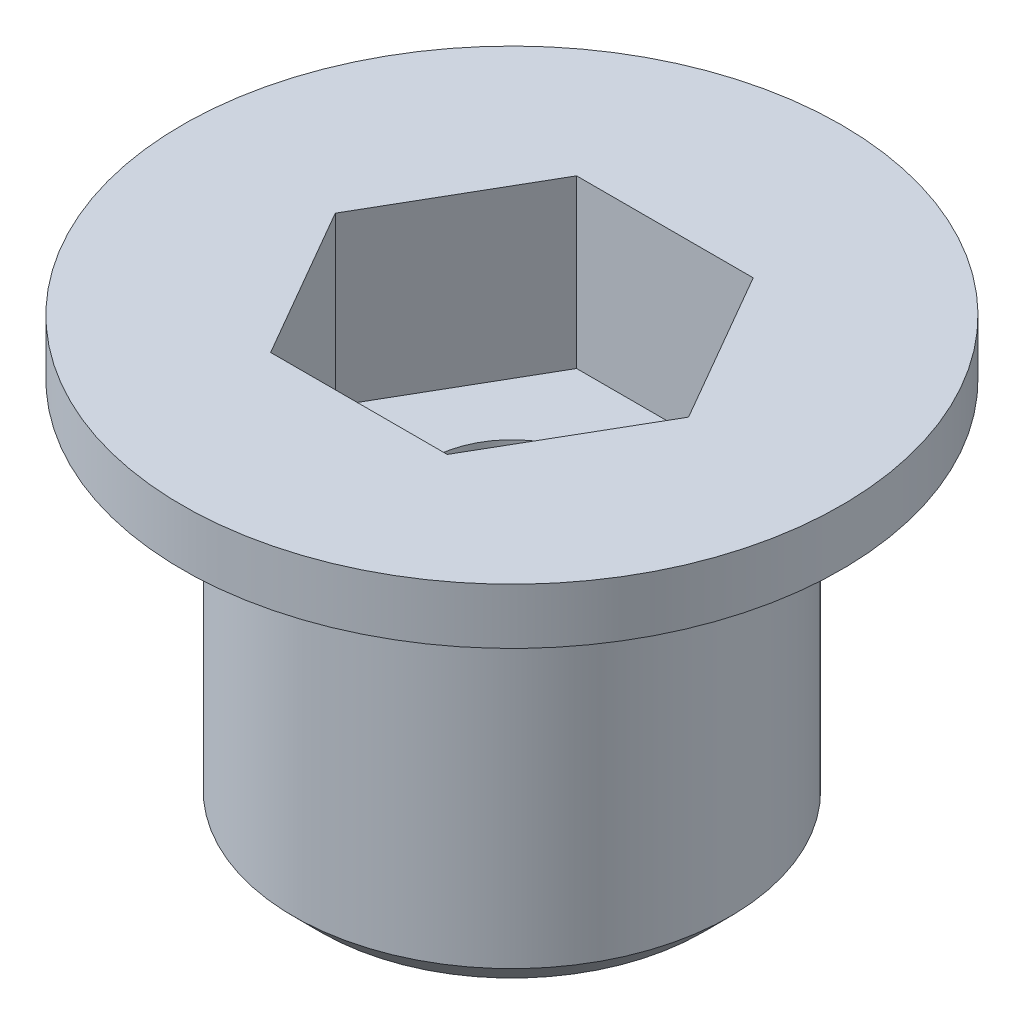
ISO-10303-21;
HEADER;
FILE_DESCRIPTION(('STEP AP214'),'2;1');
FILE_NAME('part.step','',(''),(''),'','','');
FILE_SCHEMA(('AUTOMOTIVE_DESIGN { 1 0 10303 214 1 1 1 1 }'));
ENDSEC;
DATA;
#1=APPLICATION_CONTEXT('core data for automotive mechanical design processes');
#2=APPLICATION_PROTOCOL_DEFINITION('international standard','automotive_design',2000,#1);
#3=PRODUCT_CONTEXT('',#1,'mechanical');
#4=PRODUCT('Part','Part','',(#3));
#5=PRODUCT_RELATED_PRODUCT_CATEGORY('part','',(#4));
#6=PRODUCT_DEFINITION_FORMATION('','',#4);
#7=PRODUCT_DEFINITION_CONTEXT('part definition',#1,'design');
#8=PRODUCT_DEFINITION('design','',#6,#7);
#9=PRODUCT_DEFINITION_SHAPE('','',#8);
#10=(LENGTH_UNIT() NAMED_UNIT(*) SI_UNIT(.MILLI.,.METRE.));
#11=(NAMED_UNIT(*) PLANE_ANGLE_UNIT() SI_UNIT($,.RADIAN.));
#12=(NAMED_UNIT(*) SI_UNIT($,.STERADIAN.) SOLID_ANGLE_UNIT());
#13=UNCERTAINTY_MEASURE_WITH_UNIT(LENGTH_MEASURE(1.E-05),#10,'distance_accuracy_value','');
#14=(GEOMETRIC_REPRESENTATION_CONTEXT(3) GLOBAL_UNCERTAINTY_ASSIGNED_CONTEXT((#13)) GLOBAL_UNIT_ASSIGNED_CONTEXT((#10,
#11,#12)) REPRESENTATION_CONTEXT('',''));
#15=CARTESIAN_POINT('',(0.,0.,0.));
#16=DIRECTION('',(0.,0.,1.));
#17=DIRECTION('',(1.,0.,0.));
#18=AXIS2_PLACEMENT_3D('',#15,#16,#17);
#19=CARTESIAN_POINT('',(0.,0.,0.));
#20=DIRECTION('',(0.,-1.,0.));
#21=DIRECTION('',(0.,0.,-1.));
#22=AXIS2_PLACEMENT_3D('',#19,#20,#21);
#23=CYLINDRICAL_SURFACE('',#22,1.5);
#24=CARTESIAN_POINT('',(0.,0.,0.));
#25=DIRECTION('',(0.,-1.,0.));
#26=DIRECTION('',(0.,0.,-1.));
#27=AXIS2_PLACEMENT_3D('',#24,#25,#26);
#28=CIRCLE('',#27,1.5);
#29=CARTESIAN_POINT('',(0.,0.,-1.5));
#30=VERTEX_POINT('',#29);
#31=EDGE_CURVE('E141',#30,#30,#28,.T.);
#32=ORIENTED_EDGE('',*,*,#31,.T.);
#33=EDGE_LOOP('',(#32));
#34=FACE_BOUND('',#33,.T.);
#35=CARTESIAN_POINT('',(0.,4.9,0.));
#36=DIRECTION('',(0.,1.,0.));
#37=DIRECTION('',(0.,0.,1.));
#38=AXIS2_PLACEMENT_3D('',#35,#36,#37);
#39=CIRCLE('',#38,1.5);
#40=CARTESIAN_POINT('',(0.,4.9,1.5));
#41=VERTEX_POINT('',#40);
#42=EDGE_CURVE('E37',#41,#41,#39,.T.);
#43=ORIENTED_EDGE('',*,*,#42,.T.);
#44=EDGE_LOOP('',(#43));
#45=FACE_BOUND('',#44,.T.);
#46=ADVANCED_FACE('F33',(#34,#45),#23,.F.);
#47=CARTESIAN_POINT('',(1.5,7.9,0.));
#48=DIRECTION('',(0.,1.,0.));
#49=DIRECTION('',(0.,0.,1.));
#50=AXIS2_PLACEMENT_3D('',#47,#48,#49);
#51=PLANE('',#50);
#52=DIRECTION('',(-0.5,0.,-0.866025403784438));
#53=VECTOR('',#52,1.);
#54=CARTESIAN_POINT('',(3.17542648054294,7.9,0.));
#55=LINE('',#54,#53);
#56=CARTESIAN_POINT('',(3.17542648054294,7.9,0.));
#57=VERTEX_POINT('',#56);
#58=CARTESIAN_POINT('',(1.58771324027147,7.9,-2.75));
#59=VERTEX_POINT('',#58);
#60=EDGE_CURVE('E49',#57,#59,#55,.T.);
#61=ORIENTED_EDGE('',*,*,#60,.F.);
#62=DIRECTION('',(0.5,0.,-0.866025403784439));
#63=VECTOR('',#62,1.);
#64=CARTESIAN_POINT('',(1.58771324027147,7.9,2.75));
#65=LINE('',#64,#63);
#66=CARTESIAN_POINT('',(1.58771324027147,7.9,2.75));
#67=VERTEX_POINT('',#66);
#68=EDGE_CURVE('E132',#67,#57,#65,.T.);
#69=ORIENTED_EDGE('',*,*,#68,.F.);
#70=DIRECTION('',(1.,0.,0.));
#71=VECTOR('',#70,1.);
#72=CARTESIAN_POINT('',(-1.58771324027147,7.9,2.75));
#73=LINE('',#72,#71);
#74=CARTESIAN_POINT('',(-1.58771324027147,7.9,2.75));
#75=VERTEX_POINT('',#74);
#76=EDGE_CURVE('E130',#75,#67,#73,.T.);
#77=ORIENTED_EDGE('',*,*,#76,.F.);
#78=DIRECTION('',(0.5,0.,0.866025403784438));
#79=VECTOR('',#78,1.);
#80=CARTESIAN_POINT('',(-3.17542648054294,7.9,0.));
#81=LINE('',#80,#79);
#82=CARTESIAN_POINT('',(-3.17542648054294,7.9,0.));
#83=VERTEX_POINT('',#82);
#84=EDGE_CURVE('E97',#83,#75,#81,.T.);
#85=ORIENTED_EDGE('',*,*,#84,.F.);
#86=DIRECTION('',(-0.5,0.,0.866025403784438));
#87=VECTOR('',#86,1.);
#88=CARTESIAN_POINT('',(-1.58771324027147,7.9,-2.75));
#89=LINE('',#88,#87);
#90=CARTESIAN_POINT('',(-1.58771324027147,7.9,-2.75));
#91=VERTEX_POINT('',#90);
#92=EDGE_CURVE('E126',#91,#83,#89,.T.);
#93=ORIENTED_EDGE('',*,*,#92,.F.);
#94=DIRECTION('',(-1.,0.,0.));
#95=VECTOR('',#94,1.);
#96=CARTESIAN_POINT('',(1.58771324027147,7.9,-2.75));
#97=LINE('',#96,#95);
#98=EDGE_CURVE('E123',#59,#91,#97,.T.);
#99=ORIENTED_EDGE('',*,*,#98,.F.);
#100=EDGE_LOOP('',(#61,#69,#77,#85,#93,#99));
#101=FACE_BOUND('',#100,.T.);
#102=CARTESIAN_POINT('',(0.,7.9,0.));
#103=DIRECTION('',(0.,-1.,0.));
#104=DIRECTION('',(0.,0.,-1.));
#105=AXIS2_PLACEMENT_3D('',#102,#103,#104);
#106=CIRCLE('',#105,5.925);
#107=CARTESIAN_POINT('',(0.,7.9,-5.925));
#108=VERTEX_POINT('',#107);
#109=EDGE_CURVE('E147',#108,#108,#106,.T.);
#110=ORIENTED_EDGE('',*,*,#109,.F.);
#111=EDGE_LOOP('',(#110));
#112=FACE_BOUND('',#111,.T.);
#113=ADVANCED_FACE('F175',(#101,#112),#51,.T.);
#114=CARTESIAN_POINT('',(0.,0.,0.));
#115=DIRECTION('',(0.,-1.,0.));
#116=DIRECTION('',(0.,0.,-1.));
#117=AXIS2_PLACEMENT_3D('',#114,#115,#116);
#118=CYLINDRICAL_SURFACE('',#117,5.925);
#119=ORIENTED_EDGE('',*,*,#109,.T.);
#120=EDGE_LOOP('',(#119));
#121=FACE_BOUND('',#120,.T.);
#122=CARTESIAN_POINT('',(0.,6.9,0.));
#123=DIRECTION('',(0.,-1.,0.));
#124=DIRECTION('',(0.,0.,-1.));
#125=AXIS2_PLACEMENT_3D('',#122,#123,#124);
#126=CIRCLE('',#125,5.925);
#127=CARTESIAN_POINT('',(0.,6.9,-5.925));
#128=VERTEX_POINT('',#127);
#129=EDGE_CURVE('E144',#128,#128,#126,.T.);
#130=ORIENTED_EDGE('',*,*,#129,.F.);
#131=EDGE_LOOP('',(#130));
#132=FACE_BOUND('',#131,.T.);
#133=ADVANCED_FACE('F208',(#121,#132),#118,.T.);
#134=CARTESIAN_POINT('',(5.925,6.9,0.));
#135=DIRECTION('',(0.,-1.,0.));
#136=DIRECTION('',(0.,0.,-1.));
#137=AXIS2_PLACEMENT_3D('',#134,#135,#136);
#138=PLANE('',#137);
#139=CARTESIAN_POINT('',(0.,6.9,0.));
#140=DIRECTION('',(0.,-1.,0.));
#141=DIRECTION('',(0.,0.,-1.));
#142=AXIS2_PLACEMENT_3D('',#139,#140,#141);
#143=CIRCLE('',#142,4.425);
#144=CARTESIAN_POINT('',(0.,6.9,-4.425));
#145=VERTEX_POINT('',#144);
#146=EDGE_CURVE('E11',#145,#145,#143,.F.);
#147=ORIENTED_EDGE('',*,*,#146,.T.);
#148=EDGE_LOOP('',(#147));
#149=FACE_BOUND('',#148,.T.);
#150=ORIENTED_EDGE('',*,*,#129,.T.);
#151=EDGE_LOOP('',(#150));
#152=FACE_BOUND('',#151,.T.);
#153=ADVANCED_FACE('F205',(#149,#152),#138,.T.);
#154=CARTESIAN_POINT('',(0.,0.,0.));
#155=DIRECTION('',(0.,-1.,0.));
#156=DIRECTION('',(0.,0.,-1.));
#157=AXIS2_PLACEMENT_3D('',#154,#155,#156);
#158=CYLINDRICAL_SURFACE('',#157,3.925);
#159=CARTESIAN_POINT('',(0.,0.500000000000001,0.));
#160=DIRECTION('',(0.,-1.,0.));
#161=DIRECTION('',(0.,0.,-1.));
#162=AXIS2_PLACEMENT_3D('',#159,#160,#161);
#163=CIRCLE('',#162,3.925);
#164=CARTESIAN_POINT('',(0.,0.500000000000001,-3.925));
#165=VERTEX_POINT('',#164);
#166=EDGE_CURVE('E42',#165,#165,#163,.F.);
#167=ORIENTED_EDGE('',*,*,#166,.T.);
#168=EDGE_LOOP('',(#167));
#169=FACE_BOUND('',#168,.T.);
#170=CARTESIAN_POINT('',(0.,6.4,0.));
#171=DIRECTION('',(0.,-1.,0.));
#172=DIRECTION('',(0.,0.,-1.));
#173=AXIS2_PLACEMENT_3D('',#170,#171,#172);
#174=CIRCLE('',#173,3.925);
#175=CARTESIAN_POINT('',(0.,6.4,-3.925));
#176=VERTEX_POINT('',#175);
#177=EDGE_CURVE('E153',#176,#176,#174,.T.);
#178=ORIENTED_EDGE('',*,*,#177,.T.);
#179=EDGE_LOOP('',(#178));
#180=FACE_BOUND('',#179,.T.);
#181=ADVANCED_FACE('F159',(#169,#180),#158,.T.);
#182=CARTESIAN_POINT('',(3.925,0.,0.));
#183=DIRECTION('',(0.,-1.,0.));
#184=DIRECTION('',(0.,0.,-1.));
#185=AXIS2_PLACEMENT_3D('',#182,#183,#184);
#186=PLANE('',#185);
#187=CARTESIAN_POINT('',(0.,0.,0.));
#188=DIRECTION('',(0.,-1.,0.));
#189=DIRECTION('',(0.,0.,-1.));
#190=AXIS2_PLACEMENT_3D('',#187,#188,#189);
#191=CIRCLE('',#190,3.425);
#192=CARTESIAN_POINT('',(0.,0.,-3.425));
#193=VERTEX_POINT('',#192);
#194=EDGE_CURVE('E150',#193,#193,#191,.T.);
#195=ORIENTED_EDGE('',*,*,#194,.T.);
#196=EDGE_LOOP('',(#195));
#197=FACE_BOUND('',#196,.T.);
#198=ORIENTED_EDGE('',*,*,#31,.F.);
#199=EDGE_LOOP('',(#198));
#200=FACE_BOUND('',#199,.T.);
#201=ADVANCED_FACE('F165',(#197,#200),#186,.T.);
#202=CARTESIAN_POINT('',(0.,0.,0.));
#203=DIRECTION('',(0.,1.,0.));
#204=DIRECTION('',(0.,0.,1.));
#205=AXIS2_PLACEMENT_3D('',#202,#203,#204);
#206=CONICAL_SURFACE('',#205,3.425,0.785398163397447);
#207=ORIENTED_EDGE('',*,*,#166,.F.);
#208=EDGE_LOOP('',(#207));
#209=FACE_BOUND('',#208,.T.);
#210=ORIENTED_EDGE('',*,*,#194,.F.);
#211=EDGE_LOOP('',(#210));
#212=FACE_BOUND('',#211,.T.);
#213=ADVANCED_FACE('F162',(#209,#212),#206,.T.);
#214=CARTESIAN_POINT('',(0.,6.4,0.));
#215=DIRECTION('',(0.,1.,0.));
#216=DIRECTION('',(0.,0.,1.));
#217=AXIS2_PLACEMENT_3D('',#214,#215,#216);
#218=CONICAL_SURFACE('',#217,3.925,0.785398163397441);
#219=ORIENTED_EDGE('',*,*,#146,.F.);
#220=EDGE_LOOP('',(#219));
#221=FACE_BOUND('',#220,.T.);
#222=ORIENTED_EDGE('',*,*,#177,.F.);
#223=EDGE_LOOP('',(#222));
#224=FACE_BOUND('',#223,.T.);
#225=ADVANCED_FACE('F35',(#221,#224),#218,.T.);
#226=CARTESIAN_POINT('',(3.17542648054294,4.9,0.));
#227=DIRECTION('',(0.866025403784439,0.,-0.5));
#228=DIRECTION('',(-0.5,0.,-0.866025403784439));
#229=AXIS2_PLACEMENT_3D('',#226,#227,#228);
#230=PLANE('',#229);
#231=ORIENTED_EDGE('',*,*,#60,.T.);
#232=DIRECTION('',(0.,1.,0.));
#233=VECTOR('',#232,1.);
#234=CARTESIAN_POINT('',(1.58771324027147,4.9,-2.75));
#235=LINE('',#234,#233);
#236=CARTESIAN_POINT('',(1.58771324027147,4.9,-2.75));
#237=VERTEX_POINT('',#236);
#238=EDGE_CURVE('E79',#237,#59,#235,.T.);
#239=ORIENTED_EDGE('',*,*,#238,.F.);
#240=DIRECTION('',(-0.5,0.,-0.866025403784438));
#241=VECTOR('',#240,1.);
#242=CARTESIAN_POINT('',(3.17542648054294,4.9,0.));
#243=LINE('',#242,#241);
#244=CARTESIAN_POINT('',(3.17542648054294,4.9,0.));
#245=VERTEX_POINT('',#244);
#246=EDGE_CURVE('E134',#245,#237,#243,.T.);
#247=ORIENTED_EDGE('',*,*,#246,.F.);
#248=DIRECTION('',(0.,1.,0.));
#249=VECTOR('',#248,1.);
#250=CARTESIAN_POINT('',(3.17542648054294,4.9,0.));
#251=LINE('',#250,#249);
#252=EDGE_CURVE('E57',#245,#57,#251,.T.);
#253=ORIENTED_EDGE('',*,*,#252,.T.);
#254=EDGE_LOOP('',(#231,#239,#247,#253));
#255=FACE_BOUND('',#254,.T.);
#256=ADVANCED_FACE('F193',(#255),#230,.F.);
#257=CARTESIAN_POINT('',(1.58771324027147,4.9,2.75));
#258=DIRECTION('',(0.866025403784439,0.,0.5));
#259=DIRECTION('',(0.5,0.,-0.866025403784439));
#260=AXIS2_PLACEMENT_3D('',#257,#258,#259);
#261=PLANE('',#260);
#262=ORIENTED_EDGE('',*,*,#68,.T.);
#263=ORIENTED_EDGE('',*,*,#252,.F.);
#264=DIRECTION('',(0.5,0.,-0.866025403784439));
#265=VECTOR('',#264,1.);
#266=CARTESIAN_POINT('',(1.58771324027147,4.9,2.75));
#267=LINE('',#266,#265);
#268=CARTESIAN_POINT('',(1.58771324027147,4.9,2.75));
#269=VERTEX_POINT('',#268);
#270=EDGE_CURVE('E109',#269,#245,#267,.T.);
#271=ORIENTED_EDGE('',*,*,#270,.F.);
#272=DIRECTION('',(0.,1.,0.));
#273=VECTOR('',#272,1.);
#274=CARTESIAN_POINT('',(1.58771324027147,4.9,2.75));
#275=LINE('',#274,#273);
#276=EDGE_CURVE('E101',#269,#67,#275,.T.);
#277=ORIENTED_EDGE('',*,*,#276,.T.);
#278=EDGE_LOOP('',(#262,#263,#271,#277));
#279=FACE_BOUND('',#278,.T.);
#280=ADVANCED_FACE('F190',(#279),#261,.F.);
#281=CARTESIAN_POINT('',(-1.58771324027147,4.9,2.75));
#282=DIRECTION('',(0.,0.,1.));
#283=DIRECTION('',(1.,0.,0.));
#284=AXIS2_PLACEMENT_3D('',#281,#282,#283);
#285=PLANE('',#284);
#286=ORIENTED_EDGE('',*,*,#76,.T.);
#287=ORIENTED_EDGE('',*,*,#276,.F.);
#288=DIRECTION('',(1.,0.,0.));
#289=VECTOR('',#288,1.);
#290=CARTESIAN_POINT('',(-1.58771324027147,4.9,2.75));
#291=LINE('',#290,#289);
#292=CARTESIAN_POINT('',(-1.58771324027147,4.9,2.75));
#293=VERTEX_POINT('',#292);
#294=EDGE_CURVE('E105',#293,#269,#291,.T.);
#295=ORIENTED_EDGE('',*,*,#294,.F.);
#296=DIRECTION('',(0.,1.,0.));
#297=VECTOR('',#296,1.);
#298=CARTESIAN_POINT('',(-1.58771324027147,4.9,2.75));
#299=LINE('',#298,#297);
#300=EDGE_CURVE('E90',#293,#75,#299,.T.);
#301=ORIENTED_EDGE('',*,*,#300,.T.);
#302=EDGE_LOOP('',(#286,#287,#295,#301));
#303=FACE_BOUND('',#302,.T.);
#304=ADVANCED_FACE('F106',(#303),#285,.F.);
#305=CARTESIAN_POINT('',(-3.17542648054294,4.9,0.));
#306=DIRECTION('',(-0.866025403784439,0.,0.5));
#307=DIRECTION('',(0.5,0.,0.866025403784439));
#308=AXIS2_PLACEMENT_3D('',#305,#306,#307);
#309=PLANE('',#308);
#310=ORIENTED_EDGE('',*,*,#84,.T.);
#311=ORIENTED_EDGE('',*,*,#300,.F.);
#312=DIRECTION('',(0.5,0.,0.866025403784438));
#313=VECTOR('',#312,1.);
#314=CARTESIAN_POINT('',(-3.17542648054294,4.9,0.));
#315=LINE('',#314,#313);
#316=CARTESIAN_POINT('',(-3.17542648054294,4.9,0.));
#317=VERTEX_POINT('',#316);
#318=EDGE_CURVE('E94',#317,#293,#315,.T.);
#319=ORIENTED_EDGE('',*,*,#318,.F.);
#320=DIRECTION('',(0.,1.,0.));
#321=VECTOR('',#320,1.);
#322=CARTESIAN_POINT('',(-3.17542648054294,4.9,0.));
#323=LINE('',#322,#321);
#324=EDGE_CURVE('E102',#317,#83,#323,.T.);
#325=ORIENTED_EDGE('',*,*,#324,.T.);
#326=EDGE_LOOP('',(#310,#311,#319,#325));
#327=FACE_BOUND('',#326,.T.);
#328=ADVANCED_FACE('F92',(#327),#309,.F.);
#329=CARTESIAN_POINT('',(-1.58771324027147,4.9,-2.75));
#330=DIRECTION('',(-0.866025403784439,0.,-0.5));
#331=DIRECTION('',(-0.5,0.,0.866025403784439));
#332=AXIS2_PLACEMENT_3D('',#329,#330,#331);
#333=PLANE('',#332);
#334=ORIENTED_EDGE('',*,*,#92,.T.);
#335=ORIENTED_EDGE('',*,*,#324,.F.);
#336=DIRECTION('',(-0.5,0.,0.866025403784438));
#337=VECTOR('',#336,1.);
#338=CARTESIAN_POINT('',(-1.58771324027147,4.9,-2.75));
#339=LINE('',#338,#337);
#340=CARTESIAN_POINT('',(-1.58771324027147,4.9,-2.75));
#341=VERTEX_POINT('',#340);
#342=EDGE_CURVE('E115',#341,#317,#339,.T.);
#343=ORIENTED_EDGE('',*,*,#342,.F.);
#344=DIRECTION('',(0.,1.,0.));
#345=VECTOR('',#344,1.);
#346=CARTESIAN_POINT('',(-1.58771324027147,4.9,-2.75));
#347=LINE('',#346,#345);
#348=EDGE_CURVE('E138',#341,#91,#347,.T.);
#349=ORIENTED_EDGE('',*,*,#348,.T.);
#350=EDGE_LOOP('',(#334,#335,#343,#349));
#351=FACE_BOUND('',#350,.T.);
#352=ADVANCED_FACE('F186',(#351),#333,.F.);
#353=CARTESIAN_POINT('',(1.58771324027147,4.9,-2.75));
#354=DIRECTION('',(0.,0.,-1.));
#355=DIRECTION('',(-1.,0.,0.));
#356=AXIS2_PLACEMENT_3D('',#353,#354,#355);
#357=PLANE('',#356);
#358=ORIENTED_EDGE('',*,*,#98,.T.);
#359=ORIENTED_EDGE('',*,*,#348,.F.);
#360=DIRECTION('',(-1.,0.,0.));
#361=VECTOR('',#360,1.);
#362=CARTESIAN_POINT('',(1.58771324027147,4.9,-2.75));
#363=LINE('',#362,#361);
#364=EDGE_CURVE('E117',#237,#341,#363,.T.);
#365=ORIENTED_EDGE('',*,*,#364,.F.);
#366=ORIENTED_EDGE('',*,*,#238,.T.);
#367=EDGE_LOOP('',(#358,#359,#365,#366));
#368=FACE_BOUND('',#367,.T.);
#369=ADVANCED_FACE('F181',(#368),#357,.F.);
#370=CARTESIAN_POINT('',(0.,4.9,0.));
#371=DIRECTION('',(0.,1.,0.));
#372=DIRECTION('',(0.,0.,1.));
#373=AXIS2_PLACEMENT_3D('',#370,#371,#372);
#374=PLANE('',#373);
#375=ORIENTED_EDGE('',*,*,#42,.F.);
#376=EDGE_LOOP('',(#375));
#377=FACE_BOUND('',#376,.T.);
#378=ORIENTED_EDGE('',*,*,#246,.T.);
#379=ORIENTED_EDGE('',*,*,#364,.T.);
#380=ORIENTED_EDGE('',*,*,#342,.T.);
#381=ORIENTED_EDGE('',*,*,#318,.T.);
#382=ORIENTED_EDGE('',*,*,#294,.T.);
#383=ORIENTED_EDGE('',*,*,#270,.T.);
#384=EDGE_LOOP('',(#378,#379,#380,#381,#382,#383));
#385=FACE_BOUND('',#384,.T.);
#386=ADVANCED_FACE('F112',(#377,#385),#374,.T.);
#387=CLOSED_SHELL('',(#46,#113,#133,#153,#181,#201,#213,#225,#256,#280,#304,#328,#352,#369,#386));
#388=MANIFOLD_SOLID_BREP('B2',#387);
#389=ADVANCED_BREP_SHAPE_REPRESENTATION('',(#18,#388),#14);
#390=SHAPE_DEFINITION_REPRESENTATION(#9,#389);
ENDSEC;
END-ISO-10303-21;
